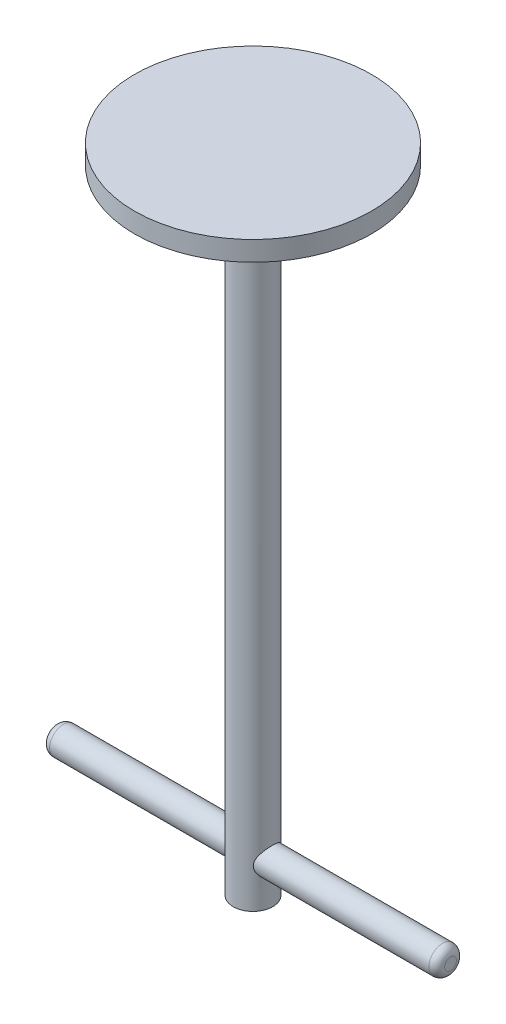
ISO-10303-21;
HEADER;
FILE_DESCRIPTION(('STEP AP214'),'2;1');
FILE_NAME('part.step','',(''),(''),'','','');
FILE_SCHEMA(('AUTOMOTIVE_DESIGN { 1 0 10303 214 1 1 1 1 }'));
ENDSEC;
DATA;
#1=APPLICATION_CONTEXT('core data for automotive mechanical design processes');
#2=APPLICATION_PROTOCOL_DEFINITION('international standard','automotive_design',2000,#1);
#3=PRODUCT_CONTEXT('',#1,'mechanical');
#4=PRODUCT('Part','Part','',(#3));
#5=PRODUCT_RELATED_PRODUCT_CATEGORY('part','',(#4));
#6=PRODUCT_DEFINITION_FORMATION('','',#4);
#7=PRODUCT_DEFINITION_CONTEXT('part definition',#1,'design');
#8=PRODUCT_DEFINITION('design','',#6,#7);
#9=PRODUCT_DEFINITION_SHAPE('','',#8);
#10=(LENGTH_UNIT() NAMED_UNIT(*) SI_UNIT(.MILLI.,.METRE.));
#11=(NAMED_UNIT(*) PLANE_ANGLE_UNIT() SI_UNIT($,.RADIAN.));
#12=(NAMED_UNIT(*) SI_UNIT($,.STERADIAN.) SOLID_ANGLE_UNIT());
#13=UNCERTAINTY_MEASURE_WITH_UNIT(LENGTH_MEASURE(1.E-05),#10,'distance_accuracy_value','');
#14=(GEOMETRIC_REPRESENTATION_CONTEXT(3) GLOBAL_UNCERTAINTY_ASSIGNED_CONTEXT((#13)) GLOBAL_UNIT_ASSIGNED_CONTEXT((#10,
#11,#12)) REPRESENTATION_CONTEXT('',''));
#15=CARTESIAN_POINT('',(0.,0.,0.));
#16=DIRECTION('',(0.,0.,1.));
#17=DIRECTION('',(1.,0.,0.));
#18=AXIS2_PLACEMENT_3D('',#15,#16,#17);
#19=CARTESIAN_POINT('',(0.,203.2,0.));
#20=DIRECTION('',(0.,-1.,0.));
#21=DIRECTION('',(0.,0.,-1.));
#22=AXIS2_PLACEMENT_3D('',#19,#20,#21);
#23=CYLINDRICAL_SURFACE('',#22,6.35);
#24=CARTESIAN_POINT('',(0.,200.66,0.));
#25=DIRECTION('',(0.,1.,0.));
#26=DIRECTION('',(0.,0.,1.));
#27=AXIS2_PLACEMENT_3D('',#24,#25,#26);
#28=CIRCLE('',#27,6.35);
#29=CARTESIAN_POINT('',(0.,200.66,6.35));
#30=VERTEX_POINT('',#29);
#31=EDGE_CURVE('E113',#30,#30,#28,.F.);
#32=ORIENTED_EDGE('',*,*,#31,.T.);
#33=EDGE_LOOP('',(#32));
#34=FACE_BOUND('',#33,.T.);
#35=CARTESIAN_POINT('',(0.,0.,0.));
#36=DIRECTION('',(0.,1.,0.));
#37=DIRECTION('',(0.,0.,1.));
#38=AXIS2_PLACEMENT_3D('',#35,#36,#37);
#39=CIRCLE('',#38,6.35);
#40=CARTESIAN_POINT('',(0.,0.,6.35));
#41=VERTEX_POINT('',#40);
#42=EDGE_CURVE('E107',#41,#41,#39,.T.);
#43=ORIENTED_EDGE('',*,*,#42,.T.);
#44=EDGE_LOOP('',(#43));
#45=FACE_BOUND('',#44,.T.);
#46=CARTESIAN_POINT('',(-4.53480705212471,12.7,4.445));
#47=CARTESIAN_POINT('',(-4.53480817435838,12.8066937895383,4.44499937226426));
#48=CARTESIAN_POINT('',(-4.5385908516571,12.9133953906309,4.44114970179175));
#49=CARTESIAN_POINT('',(-4.55351466320305,13.1257311037572,4.42584625658274));
#50=CARTESIAN_POINT('',(-4.56465673228177,13.2313650784438,4.41439151580632));
#51=CARTESIAN_POINT('',(-4.59374296170095,13.4407925351715,4.38411489349384));
#52=CARTESIAN_POINT('',(-4.61169840813297,13.5445826627062,4.36528078663444));
#53=CARTESIAN_POINT('',(-4.6535707880969,13.749437740867,4.32061506402358));
#54=CARTESIAN_POINT('',(-4.67749095539396,13.8505011801777,4.29477965186273));
#55=CARTESIAN_POINT('',(-4.75612989156855,14.1464244683287,4.20805864146235));
#56=CARTESIAN_POINT('',(-4.81813098430965,14.3366154447888,4.1375658697096));
#57=CARTESIAN_POINT('',(-4.95410739509535,14.7018928982915,3.97374457036276));
#58=CARTESIAN_POINT('',(-5.0280835469408,14.8769783222606,3.88041445241552));
#59=CARTESIAN_POINT('',(-5.19519851741961,15.2408892687278,3.65450412637949));
#60=CARTESIAN_POINT('',(-5.28942445404757,15.4267514654922,3.51791257863916));
#61=CARTESIAN_POINT('',(-5.43030880197128,15.6881637343943,3.29274248815772));
#62=CARTESIAN_POINT('',(-5.47723622902179,15.7724718745588,3.21422605992021));
#63=CARTESIAN_POINT('',(-5.57006248753736,15.9350560831763,3.05053180145258));
#64=CARTESIAN_POINT('',(-5.61596108785811,16.013330805559,2.96535249320912));
#65=CARTESIAN_POINT('',(-5.71333259865051,16.1760061319364,2.77375715261863));
#66=CARTESIAN_POINT('',(-5.76445514172369,16.2592442695683,2.66617104933573));
#67=CARTESIAN_POINT('',(-5.86267815700416,16.4162164546084,2.44262247319303));
#68=CARTESIAN_POINT('',(-5.90978043622213,16.4899547796245,2.32666380732259));
#69=CARTESIAN_POINT('',(-5.99860631962558,16.6270248840602,2.08698830160188));
#70=CARTESIAN_POINT('',(-6.04033689432561,16.6903701797786,1.96328183206009));
#71=CARTESIAN_POINT('',(-6.11719376483098,16.80578024701,1.70883584769477));
#72=CARTESIAN_POINT('',(-6.15232293538721,16.8578499302899,1.57809942629398));
#73=CARTESIAN_POINT('',(-6.22920254107761,16.9709420981324,1.24886776209414));
#74=CARTESIAN_POINT('',(-6.26656155153516,17.0250590544447,1.04687520671796));
#75=CARTESIAN_POINT('',(-6.32160276512936,17.104430097817,0.634826066962818));
#76=CARTESIAN_POINT('',(-6.33930067898737,17.129707230541,0.424776060168705));
#77=CARTESIAN_POINT('',(-6.35352469634726,17.1500402899054,0.00205416525751219));
#78=CARTESIAN_POINT('',(-6.35000968103446,17.1450375223993,-0.210622016969533));
#79=CARTESIAN_POINT('',(-6.32202480712433,17.1049657580433,-0.631721117224514));
#80=CARTESIAN_POINT('',(-6.29754910506576,17.0698883769306,-0.840142832593175));
#81=CARTESIAN_POINT('',(-6.23055861091826,16.9727723280021,-1.24229246725655));
#82=CARTESIAN_POINT('',(-6.18846819355933,16.9113671489589,-1.43624715662474));
#83=CARTESIAN_POINT('',(-6.08945775912985,16.7644751464017,-1.8106797476051));
#84=CARTESIAN_POINT('',(-6.03253482894641,16.6789835920434,-1.99115499287911));
#85=CARTESIAN_POINT('',(-5.90048404358387,16.4759575032395,-2.35550833899621));
#86=CARTESIAN_POINT('',(-5.82402997861832,16.3559034866446,-2.53749482523015));
#87=CARTESIAN_POINT('',(-5.66258695718167,16.0928175769141,-2.87985061084703));
#88=CARTESIAN_POINT('',(-5.57758884605276,15.9497609367188,-3.040196282625));
#89=CARTESIAN_POINT('',(-5.38910708932857,15.6155513963424,-3.3646833485993));
#90=CARTESIAN_POINT('',(-5.28503307926767,15.4203716902028,-3.52438847400279));
#91=CARTESIAN_POINT('',(-5.13371333179926,15.1080607205248,-3.73833974196012));
#92=CARTESIAN_POINT('',(-5.08405510127247,15.000658356742,-3.80540844681253));
#93=CARTESIAN_POINT('',(-4.98786048075575,14.7794767414051,-3.9306445853808));
#94=CARTESIAN_POINT('',(-4.94132353496536,14.6656986318248,-3.98881360622027));
#95=CARTESIAN_POINT('',(-4.82939292730599,14.3691769742368,-4.12441481410371));
#96=CARTESIAN_POINT('',(-4.76724819560771,14.1821324697493,-4.195479425512));
#97=CARTESIAN_POINT('',(-4.68801648167419,13.892332774947,-4.28328877069036));
#98=CARTESIAN_POINT('',(-4.66394281024833,13.7942301283438,-4.309421406791));
#99=CARTESIAN_POINT('',(-4.62132920856958,13.5953367769756,-4.35508801632044));
#100=CARTESIAN_POINT('',(-4.60278655059156,13.4945474240175,-4.37462524302999));
#101=CARTESIAN_POINT('',(-4.57187247315353,13.2898185825495,-4.40692541435345));
#102=CARTESIAN_POINT('',(-4.55956887495373,13.1858569777298,-4.41961400301748));
#103=CARTESIAN_POINT('',(-4.542045825116,12.9766980287702,-4.43762088504229));
#104=CARTESIAN_POINT('',(-4.5368261185292,12.8715007292403,-4.44293944365018));
#105=CARTESIAN_POINT('',(-4.53375450976119,12.660911280341,-4.44607439727054));
#106=CARTESIAN_POINT('',(-4.53590040994828,12.5555191984659,-4.44389302999035));
#107=CARTESIAN_POINT('',(-4.54742491527383,12.3455830732942,-4.43209711507275));
#108=CARTESIAN_POINT('',(-4.55680321508753,12.2410389943865,-4.42248288122301));
#109=CARTESIAN_POINT('',(-4.59155489348536,11.9589870400188,-4.38647618562038));
#110=CARTESIAN_POINT('',(-4.62358296747564,11.7831393027481,-4.35298747831399));
#111=CARTESIAN_POINT('',(-4.70356253506293,11.4402248442235,-4.26642994230559));
#112=CARTESIAN_POINT('',(-4.75153081102869,11.2731675935215,-4.21334047070603));
#113=CARTESIAN_POINT('',(-4.88377603614723,10.8731460101277,-4.06024843221093));
#114=CARTESIAN_POINT('',(-4.97451235728908,10.6462066217887,-3.9499274573229));
#115=CARTESIAN_POINT('',(-5.1183519020576,10.3246613314823,-3.75917535437004));
#116=CARTESIAN_POINT('',(-5.16766164218047,10.2204917409153,-3.69126733913885));
#117=CARTESIAN_POINT('',(-5.26752582665756,10.0185744762866,-3.54730037094088));
#118=CARTESIAN_POINT('',(-5.31808012642954,9.92082606106266,-3.47124236136062));
#119=CARTESIAN_POINT('',(-5.47157669756017,9.63402590011247,-3.22822410221054));
#120=CARTESIAN_POINT('',(-5.57451767422398,9.4553298251666,-3.0487416393871));
#121=CARTESIAN_POINT('',(-5.7705229833228,9.12909625853156,-2.65915223171059));
#122=CARTESIAN_POINT('',(-5.86360169672521,8.98151307870349,-2.44909096847762));
#123=CARTESIAN_POINT('',(-6.01775884812271,8.74326097058672,-2.03697587503018));
#124=CARTESIAN_POINT('',(-6.08157679555183,8.64725361627899,-1.83908252042203));
#125=CARTESIAN_POINT('',(-6.16381241836301,8.52519528612124,-1.53014216100333));
#126=CARTESIAN_POINT('',(-6.18898074106654,8.48816089037639,-1.42511517042238));
#127=CARTESIAN_POINT('',(-6.23429261202296,8.42185555243998,-1.21160233712545));
#128=CARTESIAN_POINT('',(-6.25443833085132,8.39258125628585,-1.10311801147655));
#129=CARTESIAN_POINT('',(-6.28934471809113,8.34205128571164,-0.882708606186502));
#130=CARTESIAN_POINT('',(-6.30407072456167,8.32084719611216,-0.770766178891975));
#131=CARTESIAN_POINT('',(-6.32758466604958,8.28706443384688,-0.545015755388296));
#132=CARTESIAN_POINT('',(-6.33637526377652,8.27448189339281,-0.431208619216148));
#133=CARTESIAN_POINT('',(-6.34779628702463,8.25814488075048,-0.202662090398155));
#134=CARTESIAN_POINT('',(-6.35042722167452,8.2543896789359,-0.0879227755885301));
#135=CARTESIAN_POINT('',(-6.34945989567658,8.25577158273717,0.141469078953986));
#136=CARTESIAN_POINT('',(-6.3458621029842,8.26090802033677,0.256121624558315));
#137=CARTESIAN_POINT('',(-6.33318075434035,8.27905652485057,0.473258392634382));
#138=CARTESIAN_POINT('',(-6.3246629237035,8.29125667899946,0.575844576195411));
#139=CARTESIAN_POINT('',(-6.30281617397871,8.32265611681435,0.779430912865084));
#140=CARTESIAN_POINT('',(-6.28948572866459,8.3418576208402,0.880430552217448));
#141=CARTESIAN_POINT('',(-6.24266016011324,8.4096117919155,1.18000332653638));
#142=CARTESIAN_POINT('',(-6.20231996608768,8.46832921816216,1.37532485761209));
#143=CARTESIAN_POINT('',(-6.10475557397192,8.61264373189645,1.75931162717061));
#144=CARTESIAN_POINT('',(-6.04698969135255,8.69910993961061,1.94750439354324));
#145=CARTESIAN_POINT('',(-5.91920622575194,8.89499839306222,2.30692333360343));
#146=CARTESIAN_POINT('',(-5.84918627327519,9.0044250793444,2.47814621587919));
#147=CARTESIAN_POINT('',(-5.68958211267469,9.26216735314297,2.82728501030964));
#148=CARTESIAN_POINT('',(-5.59865076334374,9.41388838947017,3.00206037649463));
#149=CARTESIAN_POINT('',(-5.41278864115981,9.74160217467696,3.32551437484808));
#150=CARTESIAN_POINT('',(-5.31784984430135,9.91764539641265,3.47413723857483));
#151=CARTESIAN_POINT('',(-5.17116088376289,10.2129910171637,3.68654238045336));
#152=CARTESIAN_POINT('',(-5.11805089648958,10.3249903206361,3.75970536628681));
#153=CARTESIAN_POINT('',(-5.01491068402902,10.5562697675252,3.89621323367549));
#154=CARTESIAN_POINT('',(-4.96488132954294,10.6755519505545,3.95955534709653));
#155=CARTESIAN_POINT('',(-4.87006008376553,10.9207429206969,4.0756128160575));
#156=CARTESIAN_POINT('',(-4.82525443009759,11.0466329669901,4.12835637296903));
#157=CARTESIAN_POINT('',(-4.74297788425414,11.3048969846044,4.22262742395083));
#158=CARTESIAN_POINT('',(-4.70550514943613,11.4372693165534,4.26415773672454));
#159=CARTESIAN_POINT('',(-4.65107391965118,11.6628294110016,4.32331466723001));
#160=CARTESIAN_POINT('',(-4.63142948691346,11.7544988322311,4.34430437034882));
#161=CARTESIAN_POINT('',(-4.59716981237299,11.9398795723404,4.38054261843183));
#162=CARTESIAN_POINT('',(-4.58255296669033,12.0335902298703,4.39579299447872));
#163=CARTESIAN_POINT('',(-4.55893009344278,12.222376308128,4.42028819027883));
#164=CARTESIAN_POINT('',(-4.54991683618506,12.3174498077366,4.42954074901578));
#165=CARTESIAN_POINT('',(-4.53785568566579,12.5083469230579,4.4418960346315));
#166=CARTESIAN_POINT('',(-4.53480604416253,12.6041703106672,4.44500056381651));
#167=CARTESIAN_POINT('',(-4.53480705212471,12.7,4.445));
#168=B_SPLINE_CURVE_WITH_KNOTS('',3,(#46,#47,#48,#49,#50,#51,#52,#53,#54,#55,#56,#57,#58,#59,
#60,#61,#62,#63,#64,#65,#66,#67,#68,#69,#70,#71,#72,#73,#74,#75,#76,#77,#78,#79,#80,#81,#82,#83,
#84,#85,#86,#87,#88,#89,#90,#91,#92,#93,#94,#95,#96,#97,#98,#99,#100,#101,#102,#103,#104,#105,
#106,#107,#108,#109,#110,#111,#112,#113,#114,#115,#116,#117,#118,#119,#120,#121,#122,#123,#124,
#125,#126,#127,#128,#129,#130,#131,#132,#133,#134,#135,#136,#137,#138,#139,#140,#141,#142,#143,
#144,#145,#146,#147,#148,#149,#150,#151,#152,#153,#154,#155,#156,#157,#158,#159,#160,#161,#162,
#163,#164,#165,#166,#167),.UNSPECIFIED.,.T.,.F.,(4,2,2,2,2,2,2,2,2,2,2,2,2,2,2,2,2,2,2,2,2,2,2,
2,2,2,2,2,2,2,2,2,2,2,2,2,2,2,2,2,2,2,2,2,2,2,2,2,2,2,2,2,2,2,2,2,2,2,2,2,4),(0.,
0.319961090343784,0.639962831769823,0.9604969739257,1.28120527248742,1.91474985974657,
2.54833857851342,3.29288327875049,3.66582285231053,4.03884539020629,4.47420897352057,
4.90937582952367,5.34397217952196,5.7783788325698,6.41267801905818,7.04646998654551,
7.6814908806916,8.31668886485539,8.93739239649857,9.55821792662888,10.2487241931761,
10.939978364017,11.7546838728289,12.1623275780287,12.5698985012087,13.1957467427592,
13.5084512847206,13.8210013545063,14.1368798167071,14.4527469101585,14.7685197684424,
15.0842792967118,15.6273792592386,16.1710528364838,16.9708384657586,17.3718491847736,
17.7728135356235,18.5892956576327,19.4045703230328,20.0885218790786,20.4306834414943,
20.7726968775734,21.1168611491107,21.4608709208491,21.8048522573574,22.1488077521575,
22.459413211449,22.7701172598101,23.3910051958211,24.0336313249731,24.6763818524316,
25.4196456663554,26.164475723186,26.5958226731905,27.027290983496,27.4575955506047,
27.887791849976,28.1757212497948,28.4635587101951,28.7510240307355,29.0384050678033),.UNSPECIFIED.);
#169=CARTESIAN_POINT('',(-4.53480705212471,12.7,4.445));
#170=VERTEX_POINT('',#169);
#171=EDGE_CURVE('E66',#170,#170,#168,.T.);
#172=ORIENTED_EDGE('',*,*,#171,.F.);
#173=EDGE_LOOP('',(#172));
#174=FACE_BOUND('',#173,.T.);
#175=CARTESIAN_POINT('',(4.53480705212471,12.7,4.445));
#176=CARTESIAN_POINT('',(4.53480817435838,12.5933062104617,4.44499937226426));
#177=CARTESIAN_POINT('',(4.5385908516571,12.486604609369,4.44114970179175));
#178=CARTESIAN_POINT('',(4.55351466320305,12.2742688962428,4.42584625658274));
#179=CARTESIAN_POINT('',(4.56465673228177,12.1686349215562,4.41439151580632));
#180=CARTESIAN_POINT('',(4.59374296170095,11.9592074648285,4.38411489349384));
#181=CARTESIAN_POINT('',(4.61169840813297,11.8554173372938,4.36528078663444));
#182=CARTESIAN_POINT('',(4.6535707880969,11.650562259133,4.32061506402358));
#183=CARTESIAN_POINT('',(4.67749095539396,11.5494988198223,4.29477965186273));
#184=CARTESIAN_POINT('',(4.75612989156855,11.2535755316713,4.20805864146235));
#185=CARTESIAN_POINT('',(4.81813098430965,11.0633845552112,4.1375658697096));
#186=CARTESIAN_POINT('',(4.95410739509535,10.6981071017085,3.97374457036276));
#187=CARTESIAN_POINT('',(5.0280835469408,10.5230216777394,3.88041445241552));
#188=CARTESIAN_POINT('',(5.19519851741961,10.1591107312722,3.65450412637949));
#189=CARTESIAN_POINT('',(5.28942445404757,9.97324853450776,3.51791257863916));
#190=CARTESIAN_POINT('',(5.43030880197128,9.71183626560567,3.29274248815772));
#191=CARTESIAN_POINT('',(5.47723622902179,9.62752812544116,3.2142260599202));
#192=CARTESIAN_POINT('',(5.57006248753736,9.46494391682375,3.05053180145258));
#193=CARTESIAN_POINT('',(5.61596108785811,9.38666919444102,2.96535249320911));
#194=CARTESIAN_POINT('',(5.71333259865051,9.22399386806359,2.77375715261863));
#195=CARTESIAN_POINT('',(5.76445514172369,9.1407557304317,2.66617104933573));
#196=CARTESIAN_POINT('',(5.86267815700416,8.98378354539158,2.44262247319303));
#197=CARTESIAN_POINT('',(5.90978043622213,8.91004522037555,2.32666380732259));
#198=CARTESIAN_POINT('',(5.99860631962558,8.77297511593976,2.08698830160187));
#199=CARTESIAN_POINT('',(6.04033689432561,8.70962982022137,1.96328183206009));
#200=CARTESIAN_POINT('',(6.11719376483098,8.59421975299003,1.70883584769476));
#201=CARTESIAN_POINT('',(6.15232293538721,8.5421500697101,1.57809942629398));
#202=CARTESIAN_POINT('',(6.22920254107761,8.42905790186762,1.24886776209414));
#203=CARTESIAN_POINT('',(6.26656155153516,8.3749409455553,1.04687520671796));
#204=CARTESIAN_POINT('',(6.32160276512936,8.29556990218297,0.634826066962817));
#205=CARTESIAN_POINT('',(6.33930067898737,8.27029276945897,0.424776060168703));
#206=CARTESIAN_POINT('',(6.35352469634726,8.24995971009455,0.00205416525750996));
#207=CARTESIAN_POINT('',(6.35000968103446,8.25496247760068,-0.210622016969536));
#208=CARTESIAN_POINT('',(6.32202480712433,8.29503424195673,-0.631721117224517));
#209=CARTESIAN_POINT('',(6.29754910506577,8.3301116230694,-0.840142832593178));
#210=CARTESIAN_POINT('',(6.23055861091826,8.42722767199793,-1.24229246725656));
#211=CARTESIAN_POINT('',(6.18846819355933,8.48863285104114,-1.43624715662474));
#212=CARTESIAN_POINT('',(6.08945775912985,8.6355248535983,-1.81067974760511));
#213=CARTESIAN_POINT('',(6.03253482894641,8.72101640795658,-1.99115499287911));
#214=CARTESIAN_POINT('',(5.90048404358387,8.92404249676045,-2.35550833899621));
#215=CARTESIAN_POINT('',(5.82402997861831,9.04409651335545,-2.53749482523016));
#216=CARTESIAN_POINT('',(5.66258695718167,9.30718242308587,-2.87985061084704));
#217=CARTESIAN_POINT('',(5.57758884605276,9.4502390632812,-3.04019628262501));
#218=CARTESIAN_POINT('',(5.38910708932857,9.78444860365757,-3.3646833485993));
#219=CARTESIAN_POINT('',(5.28503307926767,9.9796283097972,-3.52438847400279));
#220=CARTESIAN_POINT('',(5.13371333179926,10.2919392794752,-3.73833974196012));
#221=CARTESIAN_POINT('',(5.08405510127247,10.399341643258,-3.80540844681253));
#222=CARTESIAN_POINT('',(4.98786048075575,10.6205232585949,-3.9306445853808));
#223=CARTESIAN_POINT('',(4.94132353496536,10.7343013681752,-3.98881360622027));
#224=CARTESIAN_POINT('',(4.82939292730599,11.0308230257632,-4.12441481410371));
#225=CARTESIAN_POINT('',(4.76724819560771,11.2178675302507,-4.195479425512));
#226=CARTESIAN_POINT('',(4.68801648167419,11.507667225053,-4.28328877069036));
#227=CARTESIAN_POINT('',(4.66394281024833,11.6057698716562,-4.309421406791));
#228=CARTESIAN_POINT('',(4.62132920856958,11.8046632230244,-4.35508801632044));
#229=CARTESIAN_POINT('',(4.60278655059156,11.9054525759825,-4.37462524302999));
#230=CARTESIAN_POINT('',(4.57187247315353,12.1101814174505,-4.40692541435345));
#231=CARTESIAN_POINT('',(4.55956887495373,12.2141430222702,-4.41961400301748));
#232=CARTESIAN_POINT('',(4.542045825116,12.4233019712298,-4.43762088504229));
#233=CARTESIAN_POINT('',(4.5368261185292,12.5284992707597,-4.44293944365018));
#234=CARTESIAN_POINT('',(4.53375450976119,12.739088719659,-4.44607439727054));
#235=CARTESIAN_POINT('',(4.53590040994828,12.8444808015341,-4.44389302999035));
#236=CARTESIAN_POINT('',(4.54742491527383,13.0544169267058,-4.43209711507275));
#237=CARTESIAN_POINT('',(4.55680321508753,13.1589610056135,-4.42248288122301));
#238=CARTESIAN_POINT('',(4.59155489348536,13.4410129599812,-4.38647618562038));
#239=CARTESIAN_POINT('',(4.62358296747564,13.6168606972519,-4.35298747831399));
#240=CARTESIAN_POINT('',(4.70356253506293,13.9597751557765,-4.26642994230559));
#241=CARTESIAN_POINT('',(4.75153081102869,14.1268324064785,-4.21334047070603));
#242=CARTESIAN_POINT('',(4.88377603614723,14.5268539898723,-4.06024843221093));
#243=CARTESIAN_POINT('',(4.97451235728908,14.7537933782113,-3.9499274573229));
#244=CARTESIAN_POINT('',(5.1183519020576,15.0753386685177,-3.75917535437003));
#245=CARTESIAN_POINT('',(5.16766164218048,15.1795082590847,-3.69126733913885));
#246=CARTESIAN_POINT('',(5.26752582665756,15.3814255237134,-3.54730037094087));
#247=CARTESIAN_POINT('',(5.31808012642954,15.4791739389373,-3.47124236136062));
#248=CARTESIAN_POINT('',(5.47157669756017,15.7659740998875,-3.22822410221053));
#249=CARTESIAN_POINT('',(5.57451767422398,15.9446701748334,-3.0487416393871));
#250=CARTESIAN_POINT('',(5.7705229833228,16.2709037414684,-2.65915223171059));
#251=CARTESIAN_POINT('',(5.86360169672521,16.4184869212965,-2.44909096847761));
#252=CARTESIAN_POINT('',(6.01775884812271,16.6567390294133,-2.03697587503017));
#253=CARTESIAN_POINT('',(6.08157679555184,16.752746383721,-1.83908252042203));
#254=CARTESIAN_POINT('',(6.16381241836301,16.8748047138788,-1.53014216100332));
#255=CARTESIAN_POINT('',(6.18898074106654,16.9118391096236,-1.42511517042237));
#256=CARTESIAN_POINT('',(6.23429261202297,16.97814444756,-1.21160233712544));
#257=CARTESIAN_POINT('',(6.25443833085132,17.0074187437142,-1.10311801147655));
#258=CARTESIAN_POINT('',(6.28934471809113,17.0579487142884,-0.882708606186496));
#259=CARTESIAN_POINT('',(6.30407072456167,17.0791528038878,-0.770766178891969));
#260=CARTESIAN_POINT('',(6.32758466604958,17.1129355661531,-0.545015755388289));
#261=CARTESIAN_POINT('',(6.33637526377652,17.1255181066072,-0.43120861921614));
#262=CARTESIAN_POINT('',(6.34779628702463,17.1418551192495,-0.202662090398145));
#263=CARTESIAN_POINT('',(6.35042722167452,17.1456103210641,-0.0879227755885204));
#264=CARTESIAN_POINT('',(6.34945989567658,17.1442284172628,0.141469078953994));
#265=CARTESIAN_POINT('',(6.3458621029842,17.1390919796632,0.256121624558322));
#266=CARTESIAN_POINT('',(6.33318075434035,17.1209434751494,0.473258392634388));
#267=CARTESIAN_POINT('',(6.3246629237035,17.1087433210005,0.575844576195417));
#268=CARTESIAN_POINT('',(6.30281617397871,17.0773438831856,0.779430912865091));
#269=CARTESIAN_POINT('',(6.28948572866459,17.0581423791598,0.880430552217454));
#270=CARTESIAN_POINT('',(6.24266016011324,16.9903882080845,1.18000332653639));
#271=CARTESIAN_POINT('',(6.20231996608768,16.9316707818378,1.37532485761209));
#272=CARTESIAN_POINT('',(6.10475557397192,16.7873562681036,1.75931162717061));
#273=CARTESIAN_POINT('',(6.04698969135254,16.7008900603894,1.94750439354325));
#274=CARTESIAN_POINT('',(5.91920622575193,16.5050016069378,2.30692333360344));
#275=CARTESIAN_POINT('',(5.84918627327519,16.3955749206556,2.47814621587919));
#276=CARTESIAN_POINT('',(5.68958211267468,16.137832646857,2.82728501030965));
#277=CARTESIAN_POINT('',(5.59865076334374,15.9861116105298,3.00206037649464));
#278=CARTESIAN_POINT('',(5.41278864115981,15.658397825323,3.32551437484809));
#279=CARTESIAN_POINT('',(5.31784984430135,15.4823546035873,3.47413723857484));
#280=CARTESIAN_POINT('',(5.17116088376288,15.1870089828363,3.68654238045336));
#281=CARTESIAN_POINT('',(5.11805089648957,15.0750096793639,3.75970536628682));
#282=CARTESIAN_POINT('',(5.01491068402902,14.8437302324748,3.8962132336755));
#283=CARTESIAN_POINT('',(4.96488132954294,14.7244480494455,3.95955534709654));
#284=CARTESIAN_POINT('',(4.87006008376553,14.4792570793031,4.0756128160575));
#285=CARTESIAN_POINT('',(4.82525443009759,14.3533670330098,4.12835637296903));
#286=CARTESIAN_POINT('',(4.74297788425414,14.0951030153956,4.22262742395083));
#287=CARTESIAN_POINT('',(4.70550514943613,13.9627306834465,4.26415773672455));
#288=CARTESIAN_POINT('',(4.65107391965118,13.7371705889984,4.32331466723001));
#289=CARTESIAN_POINT('',(4.63142948691346,13.6455011677689,4.34430437034882));
#290=CARTESIAN_POINT('',(4.59716981237299,13.4601204276596,4.38054261843183));
#291=CARTESIAN_POINT('',(4.58255296669033,13.3664097701297,4.39579299447872));
#292=CARTESIAN_POINT('',(4.55893009344278,13.177623691872,4.42028819027883));
#293=CARTESIAN_POINT('',(4.54991683618506,13.0825501922634,4.42954074901578));
#294=CARTESIAN_POINT('',(4.53785568566579,12.8916530769421,4.4418960346315));
#295=CARTESIAN_POINT('',(4.53480604416253,12.7958296893328,4.44500056381651));
#296=CARTESIAN_POINT('',(4.53480705212471,12.7,4.445));
#297=B_SPLINE_CURVE_WITH_KNOTS('',3,(#175,#176,#177,#178,#179,#180,#181,#182,#183,#184,#185,
#186,#187,#188,#189,#190,#191,#192,#193,#194,#195,#196,#197,#198,#199,#200,#201,#202,#203,#204,
#205,#206,#207,#208,#209,#210,#211,#212,#213,#214,#215,#216,#217,#218,#219,#220,#221,#222,#223,
#224,#225,#226,#227,#228,#229,#230,#231,#232,#233,#234,#235,#236,#237,#238,#239,#240,#241,#242,
#243,#244,#245,#246,#247,#248,#249,#250,#251,#252,#253,#254,#255,#256,#257,#258,#259,#260,#261,
#262,#263,#264,#265,#266,#267,#268,#269,#270,#271,#272,#273,#274,#275,#276,#277,#278,#279,#280,
#281,#282,#283,#284,#285,#286,#287,#288,#289,#290,#291,#292,#293,#294,#295,#296),.UNSPECIFIED.,
.T.,.F.,(4,2,2,2,2,2,2,2,2,2,2,2,2,2,2,2,2,2,2,2,2,2,2,2,2,2,2,2,2,2,2,2,2,2,2,2,2,2,2,2,2,2,2,
2,2,2,2,2,2,2,2,2,2,2,2,2,2,2,2,2,4),(0.,0.319961090343786,0.639962831769825,0.960496973925697,
1.28120527248742,1.91474985974657,2.54833857851342,3.29288327875049,3.66582285231053,
4.03884539020629,4.47420897352057,4.90937582952367,5.34397217952196,5.7783788325698,
6.41267801905818,7.04646998654551,7.6814908806916,8.31668886485539,8.93739239649857,
9.55821792662888,10.2487241931761,10.939978364017,11.7546838728289,12.1623275780287,
12.5698985012087,13.1957467427592,13.5084512847206,13.8210013545063,14.1368798167071,
14.4527469101585,14.7685197684424,15.0842792967118,15.6273792592386,16.1710528364838,
16.9708384657586,17.3718491847736,17.7728135356235,18.5892956576327,19.4045703230328,
20.0885218790786,20.4306834414943,20.7726968775734,21.1168611491107,21.4608709208491,
21.8048522573574,22.1488077521575,22.459413211449,22.7701172598101,23.3910051958211,
24.0336313249731,24.6763818524316,25.4196456663554,26.164475723186,26.5958226731905,
27.027290983496,27.4575955506047,27.887791849976,28.1757212497948,28.4635587101951,
28.7510240307355,29.0384050678033),.UNSPECIFIED.);
#298=CARTESIAN_POINT('',(4.53480705212471,12.7,4.445));
#299=VERTEX_POINT('',#298);
#300=EDGE_CURVE('E58',#299,#299,#297,.T.);
#301=ORIENTED_EDGE('',*,*,#300,.F.);
#302=EDGE_LOOP('',(#301));
#303=FACE_BOUND('',#302,.T.);
#304=ADVANCED_FACE('F38',(#34,#45,#174,#303),#23,.T.);
#305=CARTESIAN_POINT('',(0.,0.,0.));
#306=DIRECTION('',(0.,1.,0.));
#307=DIRECTION('',(0.,0.,1.));
#308=AXIS2_PLACEMENT_3D('',#305,#306,#307);
#309=PLANE('',#308);
#310=ORIENTED_EDGE('',*,*,#42,.F.);
#311=EDGE_LOOP('',(#310));
#312=FACE_BOUND('',#311,.T.);
#313=ADVANCED_FACE('F96',(#312),#309,.F.);
#314=CARTESIAN_POINT('',(0.,203.2,0.));
#315=DIRECTION('',(0.,-1.,0.));
#316=DIRECTION('',(0.,0.,-1.));
#317=AXIS2_PLACEMENT_3D('',#314,#315,#316);
#318=CONICAL_SURFACE('',#317,3.81000000000001,0.785398163397449);
#319=ORIENTED_EDGE('',*,*,#31,.F.);
#320=EDGE_LOOP('',(#319));
#321=FACE_BOUND('',#320,.T.);
#322=CARTESIAN_POINT('',(0.,203.2,0.));
#323=DIRECTION('',(0.,1.,0.));
#324=DIRECTION('',(0.,0.,1.));
#325=AXIS2_PLACEMENT_3D('',#322,#323,#324);
#326=CIRCLE('',#325,3.81000000000001);
#327=CARTESIAN_POINT('',(0.,203.2,3.81000000000001));
#328=VERTEX_POINT('',#327);
#329=EDGE_CURVE('E109',#328,#328,#326,.T.);
#330=ORIENTED_EDGE('',*,*,#329,.F.);
#331=EDGE_LOOP('',(#330));
#332=FACE_BOUND('',#331,.T.);
#333=ADVANCED_FACE('F94',(#321,#332),#318,.T.);
#334=CARTESIAN_POINT('',(0.,209.55,0.));
#335=DIRECTION('',(0.,-1.,0.));
#336=DIRECTION('',(0.,0.,-1.));
#337=AXIS2_PLACEMENT_3D('',#334,#335,#336);
#338=CYLINDRICAL_SURFACE('',#337,38.1);
#339=CARTESIAN_POINT('',(0.,209.55,0.));
#340=DIRECTION('',(0.,1.,0.));
#341=DIRECTION('',(0.,0.,1.));
#342=AXIS2_PLACEMENT_3D('',#339,#340,#341);
#343=CIRCLE('',#342,38.1);
#344=CARTESIAN_POINT('',(0.,209.55,38.1));
#345=VERTEX_POINT('',#344);
#346=EDGE_CURVE('E110',#345,#345,#343,.T.);
#347=ORIENTED_EDGE('',*,*,#346,.F.);
#348=EDGE_LOOP('',(#347));
#349=FACE_BOUND('',#348,.T.);
#350=CARTESIAN_POINT('',(0.,203.2,0.));
#351=DIRECTION('',(0.,1.,0.));
#352=DIRECTION('',(0.,0.,1.));
#353=AXIS2_PLACEMENT_3D('',#350,#351,#352);
#354=CIRCLE('',#353,38.1);
#355=CARTESIAN_POINT('',(0.,203.2,38.1));
#356=VERTEX_POINT('',#355);
#357=EDGE_CURVE('E116',#356,#356,#354,.T.);
#358=ORIENTED_EDGE('',*,*,#357,.T.);
#359=EDGE_LOOP('',(#358));
#360=FACE_BOUND('',#359,.T.);
#361=ADVANCED_FACE('F88',(#349,#360),#338,.T.);
#362=CARTESIAN_POINT('',(0.,209.55,0.));
#363=DIRECTION('',(0.,1.,0.));
#364=DIRECTION('',(0.,0.,1.));
#365=AXIS2_PLACEMENT_3D('',#362,#363,#364);
#366=PLANE('',#365);
#367=ORIENTED_EDGE('',*,*,#346,.T.);
#368=EDGE_LOOP('',(#367));
#369=FACE_BOUND('',#368,.T.);
#370=ADVANCED_FACE('F83',(#369),#366,.T.);
#371=CARTESIAN_POINT('',(0.,203.2,0.));
#372=DIRECTION('',(0.,1.,0.));
#373=DIRECTION('',(0.,0.,1.));
#374=AXIS2_PLACEMENT_3D('',#371,#372,#373);
#375=PLANE('',#374);
#376=ORIENTED_EDGE('',*,*,#329,.T.);
#377=EDGE_LOOP('',(#376));
#378=FACE_BOUND('',#377,.T.);
#379=ORIENTED_EDGE('',*,*,#357,.F.);
#380=EDGE_LOOP('',(#379));
#381=FACE_BOUND('',#380,.T.);
#382=ADVANCED_FACE('F87',(#378,#381),#375,.F.);
#383=CARTESIAN_POINT('',(-63.5,12.7,0.));
#384=DIRECTION('',(1.,0.,0.));
#385=DIRECTION('',(0.,0.,-1.));
#386=AXIS2_PLACEMENT_3D('',#383,#384,#385);
#387=PLANE('',#386);
#388=CARTESIAN_POINT('',(-63.5,12.7,0.));
#389=DIRECTION('',(1.,0.,0.));
#390=DIRECTION('',(0.,0.,-1.));
#391=AXIS2_PLACEMENT_3D('',#388,#389,#390);
#392=CIRCLE('',#391,1.905);
#393=CARTESIAN_POINT('',(-63.5,12.7,-1.905));
#394=VERTEX_POINT('',#393);
#395=EDGE_CURVE('E49',#394,#394,#392,.F.);
#396=ORIENTED_EDGE('',*,*,#395,.T.);
#397=EDGE_LOOP('',(#396));
#398=FACE_BOUND('',#397,.T.);
#399=ADVANCED_FACE('F81',(#398),#387,.F.);
#400=CARTESIAN_POINT('',(63.5,12.7,0.));
#401=DIRECTION('',(-1.,0.,0.));
#402=DIRECTION('',(0.,0.,1.));
#403=AXIS2_PLACEMENT_3D('',#400,#401,#402);
#404=CYLINDRICAL_SURFACE('',#403,4.445);
#405=CARTESIAN_POINT('',(-60.96,12.7,0.));
#406=DIRECTION('',(1.,0.,0.));
#407=DIRECTION('',(0.,0.,-1.));
#408=AXIS2_PLACEMENT_3D('',#405,#406,#407);
#409=CIRCLE('',#408,4.445);
#410=CARTESIAN_POINT('',(-60.96,12.7,-4.445));
#411=VERTEX_POINT('',#410);
#412=EDGE_CURVE('E53',#411,#411,#409,.T.);
#413=ORIENTED_EDGE('',*,*,#412,.T.);
#414=EDGE_LOOP('',(#413));
#415=FACE_BOUND('',#414,.T.);
#416=ORIENTED_EDGE('',*,*,#171,.T.);
#417=EDGE_LOOP('',(#416));
#418=FACE_BOUND('',#417,.T.);
#419=ADVANCED_FACE('F80',(#415,#418),#404,.T.);
#420=CARTESIAN_POINT('',(60.96,12.7,0.));
#421=DIRECTION('',(1.,0.,0.));
#422=DIRECTION('',(0.,0.,-1.));
#423=AXIS2_PLACEMENT_3D('',#420,#421,#422);
#424=CIRCLE('',#423,4.445);
#425=CARTESIAN_POINT('',(60.96,12.7,-4.445));
#426=VERTEX_POINT('',#425);
#427=EDGE_CURVE('E10',#426,#426,#424,.F.);
#428=ORIENTED_EDGE('',*,*,#427,.T.);
#429=EDGE_LOOP('',(#428));
#430=FACE_BOUND('',#429,.T.);
#431=ORIENTED_EDGE('',*,*,#300,.T.);
#432=EDGE_LOOP('',(#431));
#433=FACE_BOUND('',#432,.T.);
#434=ADVANCED_FACE('F74',(#430,#433),#404,.T.);
#435=CARTESIAN_POINT('',(63.5,12.7,0.));
#436=DIRECTION('',(1.,0.,0.));
#437=DIRECTION('',(0.,0.,-1.));
#438=AXIS2_PLACEMENT_3D('',#435,#436,#437);
#439=PLANE('',#438);
#440=CARTESIAN_POINT('',(63.5,12.7,0.));
#441=DIRECTION('',(1.,0.,0.));
#442=DIRECTION('',(0.,0.,-1.));
#443=AXIS2_PLACEMENT_3D('',#440,#441,#442);
#444=CIRCLE('',#443,1.905);
#445=CARTESIAN_POINT('',(63.5,12.7,-1.905));
#446=VERTEX_POINT('',#445);
#447=EDGE_CURVE('E45',#446,#446,#444,.T.);
#448=ORIENTED_EDGE('',*,*,#447,.T.);
#449=EDGE_LOOP('',(#448));
#450=FACE_BOUND('',#449,.T.);
#451=ADVANCED_FACE('F79',(#450),#439,.T.);
#452=CARTESIAN_POINT('',(-60.96,12.7,0.));
#453=DIRECTION('',(1.,0.,0.));
#454=DIRECTION('',(0.,0.,-1.));
#455=AXIS2_PLACEMENT_3D('',#452,#453,#454);
#456=DEGENERATE_TOROIDAL_SURFACE('',#455,1.905,2.54,.T.);
#457=ORIENTED_EDGE('',*,*,#395,.F.);
#458=EDGE_LOOP('',(#457));
#459=FACE_BOUND('',#458,.T.);
#460=ORIENTED_EDGE('',*,*,#412,.F.);
#461=EDGE_LOOP('',(#460));
#462=FACE_BOUND('',#461,.T.);
#463=ADVANCED_FACE('F136',(#459,#462),#456,.T.);
#464=CARTESIAN_POINT('',(60.96,12.7,0.));
#465=DIRECTION('',(1.,0.,0.));
#466=DIRECTION('',(0.,0.,-1.));
#467=AXIS2_PLACEMENT_3D('',#464,#465,#466);
#468=DEGENERATE_TOROIDAL_SURFACE('',#467,1.905,2.54,.T.);
#469=ORIENTED_EDGE('',*,*,#427,.F.);
#470=EDGE_LOOP('',(#469));
#471=FACE_BOUND('',#470,.T.);
#472=ORIENTED_EDGE('',*,*,#447,.F.);
#473=EDGE_LOOP('',(#472));
#474=FACE_BOUND('',#473,.T.);
#475=ADVANCED_FACE('F40',(#471,#474),#468,.T.);
#476=CLOSED_SHELL('',(#304,#313,#333,#361,#370,#382,#399,#419,#434,#451,#463,#475));
#477=MANIFOLD_SOLID_BREP('B2',#476);
#478=ADVANCED_BREP_SHAPE_REPRESENTATION('',(#18,#477),#14);
#479=SHAPE_DEFINITION_REPRESENTATION(#9,#478);
ENDSEC;
END-ISO-10303-21;
